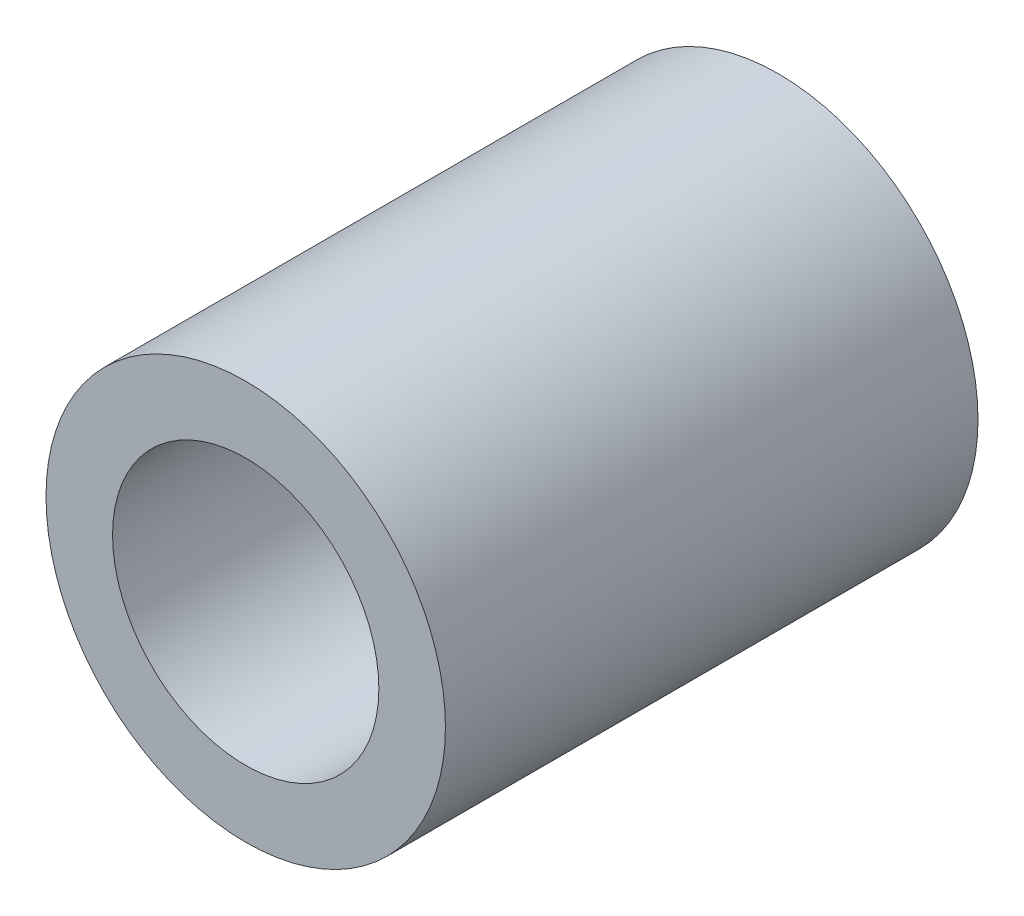
ISO-10303-21;
HEADER;
FILE_DESCRIPTION(('STEP AP214'),'2;1');
FILE_NAME('part.step','',(''),(''),'','','');
FILE_SCHEMA(('AUTOMOTIVE_DESIGN { 1 0 10303 214 1 1 1 1 }'));
ENDSEC;
DATA;
#1=APPLICATION_CONTEXT('core data for automotive mechanical design processes');
#2=APPLICATION_PROTOCOL_DEFINITION('international standard','automotive_design',2000,#1);
#3=PRODUCT_CONTEXT('',#1,'mechanical');
#4=PRODUCT('Part','Part','',(#3));
#5=PRODUCT_RELATED_PRODUCT_CATEGORY('part','',(#4));
#6=PRODUCT_DEFINITION_FORMATION('','',#4);
#7=PRODUCT_DEFINITION_CONTEXT('part definition',#1,'design');
#8=PRODUCT_DEFINITION('design','',#6,#7);
#9=PRODUCT_DEFINITION_SHAPE('','',#8);
#10=(LENGTH_UNIT() NAMED_UNIT(*) SI_UNIT(.MILLI.,.METRE.));
#11=(NAMED_UNIT(*) PLANE_ANGLE_UNIT() SI_UNIT($,.RADIAN.));
#12=(NAMED_UNIT(*) SI_UNIT($,.STERADIAN.) SOLID_ANGLE_UNIT());
#13=UNCERTAINTY_MEASURE_WITH_UNIT(LENGTH_MEASURE(1.E-05),#10,'distance_accuracy_value','');
#14=(GEOMETRIC_REPRESENTATION_CONTEXT(3) GLOBAL_UNCERTAINTY_ASSIGNED_CONTEXT((#13)) GLOBAL_UNIT_ASSIGNED_CONTEXT((#10,
#11,#12)) REPRESENTATION_CONTEXT('',''));
#15=CARTESIAN_POINT('',(0.,0.,0.));
#16=DIRECTION('',(0.,0.,1.));
#17=DIRECTION('',(1.,0.,0.));
#18=AXIS2_PLACEMENT_3D('',#15,#16,#17);
#19=CARTESIAN_POINT('',(0.,0.,12.7));
#20=DIRECTION('',(0.,0.,1.));
#21=DIRECTION('',(1.,0.,0.));
#22=AXIS2_PLACEMENT_3D('',#19,#20,#21);
#23=PLANE('',#22);
#24=CARTESIAN_POINT('',(0.,0.,12.7));
#25=DIRECTION('',(0.,0.,1.));
#26=DIRECTION('',(1.,0.,0.));
#27=AXIS2_PLACEMENT_3D('',#24,#25,#26);
#28=CIRCLE('',#27,9.525);
#29=CARTESIAN_POINT('',(9.525,0.,12.7));
#30=VERTEX_POINT('',#29);
#31=EDGE_CURVE('E10',#30,#30,#28,.T.);
#32=ORIENTED_EDGE('',*,*,#31,.T.);
#33=EDGE_LOOP('',(#32));
#34=FACE_BOUND('',#33,.T.);
#35=CARTESIAN_POINT('',(0.,0.,12.7));
#36=DIRECTION('',(0.,0.,1.));
#37=DIRECTION('',(1.,0.,0.));
#38=AXIS2_PLACEMENT_3D('',#35,#36,#37);
#39=CIRCLE('',#38,6.35);
#40=CARTESIAN_POINT('',(6.35,0.,12.7));
#41=VERTEX_POINT('',#40);
#42=EDGE_CURVE('E54',#41,#41,#39,.T.);
#43=ORIENTED_EDGE('',*,*,#42,.F.);
#44=EDGE_LOOP('',(#43));
#45=FACE_BOUND('',#44,.T.);
#46=ADVANCED_FACE('F41',(#34,#45),#23,.T.);
#47=CARTESIAN_POINT('',(0.,0.,-12.7));
#48=DIRECTION('',(0.,0.,1.));
#49=DIRECTION('',(1.,0.,0.));
#50=AXIS2_PLACEMENT_3D('',#47,#48,#49);
#51=PLANE('',#50);
#52=CARTESIAN_POINT('',(0.,0.,-12.7));
#53=DIRECTION('',(0.,0.,1.));
#54=DIRECTION('',(1.,0.,0.));
#55=AXIS2_PLACEMENT_3D('',#52,#53,#54);
#56=CIRCLE('',#55,9.525);
#57=CARTESIAN_POINT('',(9.525,0.,-12.7));
#58=VERTEX_POINT('',#57);
#59=EDGE_CURVE('E45',#58,#58,#56,.T.);
#60=ORIENTED_EDGE('',*,*,#59,.F.);
#61=EDGE_LOOP('',(#60));
#62=FACE_BOUND('',#61,.T.);
#63=CARTESIAN_POINT('',(0.,0.,-12.7));
#64=DIRECTION('',(0.,0.,1.));
#65=DIRECTION('',(1.,0.,0.));
#66=AXIS2_PLACEMENT_3D('',#63,#64,#65);
#67=CIRCLE('',#66,6.35);
#68=CARTESIAN_POINT('',(6.35,0.,-12.7));
#69=VERTEX_POINT('',#68);
#70=EDGE_CURVE('E56',#69,#69,#67,.T.);
#71=ORIENTED_EDGE('',*,*,#70,.T.);
#72=EDGE_LOOP('',(#71));
#73=FACE_BOUND('',#72,.T.);
#74=ADVANCED_FACE('F68',(#62,#73),#51,.F.);
#75=CARTESIAN_POINT('',(0.,0.,12.7));
#76=DIRECTION('',(0.,0.,-1.));
#77=DIRECTION('',(-1.,0.,0.));
#78=AXIS2_PLACEMENT_3D('',#75,#76,#77);
#79=CYLINDRICAL_SURFACE('',#78,9.525);
#80=ORIENTED_EDGE('',*,*,#31,.F.);
#81=EDGE_LOOP('',(#80));
#82=FACE_BOUND('',#81,.T.);
#83=ORIENTED_EDGE('',*,*,#59,.T.);
#84=EDGE_LOOP('',(#83));
#85=FACE_BOUND('',#84,.T.);
#86=ADVANCED_FACE('F43',(#82,#85),#79,.T.);
#87=CARTESIAN_POINT('',(0.,0.,12.7));
#88=DIRECTION('',(0.,0.,-1.));
#89=DIRECTION('',(-1.,0.,0.));
#90=AXIS2_PLACEMENT_3D('',#87,#88,#89);
#91=CYLINDRICAL_SURFACE('',#90,6.35);
#92=ORIENTED_EDGE('',*,*,#42,.T.);
#93=EDGE_LOOP('',(#92));
#94=FACE_BOUND('',#93,.T.);
#95=ORIENTED_EDGE('',*,*,#70,.F.);
#96=EDGE_LOOP('',(#95));
#97=FACE_BOUND('',#96,.T.);
#98=ADVANCED_FACE('F64',(#94,#97),#91,.F.);
#99=CLOSED_SHELL('',(#46,#74,#86,#98));
#100=MANIFOLD_SOLID_BREP('B2',#99);
#101=ADVANCED_BREP_SHAPE_REPRESENTATION('',(#18,#100),#14);
#102=SHAPE_DEFINITION_REPRESENTATION(#9,#101);
ENDSEC;
END-ISO-10303-21;
